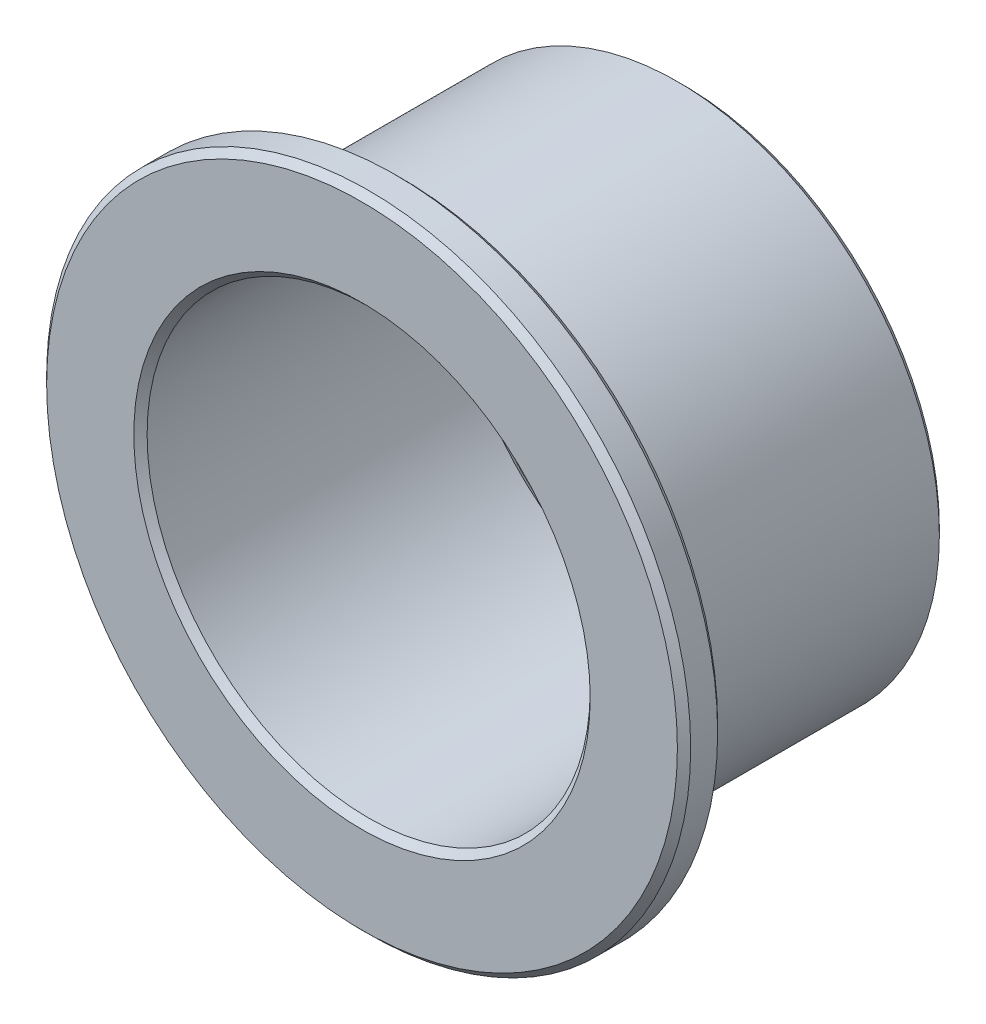
ISO-10303-21;
HEADER;
FILE_DESCRIPTION(('STEP AP214'),'2;1');
FILE_NAME('part.step','',(''),(''),'','','');
FILE_SCHEMA(('AUTOMOTIVE_DESIGN { 1 0 10303 214 1 1 1 1 }'));
ENDSEC;
DATA;
#1=APPLICATION_CONTEXT('core data for automotive mechanical design processes');
#2=APPLICATION_PROTOCOL_DEFINITION('international standard','automotive_design',2000,#1);
#3=PRODUCT_CONTEXT('',#1,'mechanical');
#4=PRODUCT('Part','Part','',(#3));
#5=PRODUCT_RELATED_PRODUCT_CATEGORY('part','',(#4));
#6=PRODUCT_DEFINITION_FORMATION('','',#4);
#7=PRODUCT_DEFINITION_CONTEXT('part definition',#1,'design');
#8=PRODUCT_DEFINITION('design','',#6,#7);
#9=PRODUCT_DEFINITION_SHAPE('','',#8);
#10=(LENGTH_UNIT() NAMED_UNIT(*) SI_UNIT(.MILLI.,.METRE.));
#11=(NAMED_UNIT(*) PLANE_ANGLE_UNIT() SI_UNIT($,.RADIAN.));
#12=(NAMED_UNIT(*) SI_UNIT($,.STERADIAN.) SOLID_ANGLE_UNIT());
#13=UNCERTAINTY_MEASURE_WITH_UNIT(LENGTH_MEASURE(1.E-05),#10,'distance_accuracy_value','');
#14=(GEOMETRIC_REPRESENTATION_CONTEXT(3) GLOBAL_UNCERTAINTY_ASSIGNED_CONTEXT((#13)) GLOBAL_UNIT_ASSIGNED_CONTEXT((#10,
#11,#12)) REPRESENTATION_CONTEXT('',''));
#15=CARTESIAN_POINT('',(0.,0.,0.));
#16=DIRECTION('',(0.,0.,1.));
#17=DIRECTION('',(1.,0.,0.));
#18=AXIS2_PLACEMENT_3D('',#15,#16,#17);
#19=CARTESIAN_POINT('',(0.,0.,9.525));
#20=DIRECTION('',(0.,0.,1.));
#21=DIRECTION('',(1.,0.,0.));
#22=AXIS2_PLACEMENT_3D('',#19,#20,#21);
#23=CYLINDRICAL_SURFACE('',#22,25.4);
#24=CARTESIAN_POINT('',(0.,0.,12.175744));
#25=DIRECTION('',(0.,0.,1.));
#26=DIRECTION('',(1.,0.,0.));
#27=AXIS2_PLACEMENT_3D('',#24,#25,#26);
#28=CIRCLE('',#27,25.4);
#29=CARTESIAN_POINT('',(25.4,0.,12.175744));
#30=VERTEX_POINT('',#29);
#31=EDGE_CURVE('E63',#30,#30,#28,.F.);
#32=ORIENTED_EDGE('',*,*,#31,.T.);
#33=EDGE_LOOP('',(#32));
#34=FACE_BOUND('',#33,.T.);
#35=CARTESIAN_POINT('',(0.,0.,10.049256));
#36=DIRECTION('',(0.,0.,1.));
#37=DIRECTION('',(1.,0.,0.));
#38=AXIS2_PLACEMENT_3D('',#35,#36,#37);
#39=CIRCLE('',#38,25.4);
#40=CARTESIAN_POINT('',(25.4,0.,10.049256));
#41=VERTEX_POINT('',#40);
#42=EDGE_CURVE('E66',#41,#41,#39,.T.);
#43=ORIENTED_EDGE('',*,*,#42,.T.);
#44=EDGE_LOOP('',(#43));
#45=FACE_BOUND('',#44,.T.);
#46=ADVANCED_FACE('F37',(#34,#45),#23,.T.);
#47=CARTESIAN_POINT('',(0.,0.,9.525));
#48=DIRECTION('',(0.,0.,1.));
#49=DIRECTION('',(1.,0.,0.));
#50=AXIS2_PLACEMENT_3D('',#47,#48,#49);
#51=PLANE('',#50);
#52=CARTESIAN_POINT('',(0.,0.,9.525));
#53=DIRECTION('',(0.,0.,1.));
#54=DIRECTION('',(1.,0.,0.));
#55=AXIS2_PLACEMENT_3D('',#52,#53,#54);
#56=CIRCLE('',#55,24.875744);
#57=CARTESIAN_POINT('',(24.875744,0.,9.525));
#58=VERTEX_POINT('',#57);
#59=EDGE_CURVE('E57',#58,#58,#56,.F.);
#60=ORIENTED_EDGE('',*,*,#59,.T.);
#61=EDGE_LOOP('',(#60));
#62=FACE_BOUND('',#61,.T.);
#63=CARTESIAN_POINT('',(0.,0.,9.525));
#64=DIRECTION('',(0.,0.,1.));
#65=DIRECTION('',(1.,0.,0.));
#66=AXIS2_PLACEMENT_3D('',#63,#64,#65);
#67=CIRCLE('',#66,21.187156);
#68=CARTESIAN_POINT('',(21.187156,0.,9.525));
#69=VERTEX_POINT('',#68);
#70=EDGE_CURVE('E60',#69,#69,#67,.T.);
#71=ORIENTED_EDGE('',*,*,#70,.T.);
#72=EDGE_LOOP('',(#71));
#73=FACE_BOUND('',#72,.T.);
#74=ADVANCED_FACE('F97',(#62,#73),#51,.F.);
#75=CARTESIAN_POINT('',(0.,0.,12.7));
#76=DIRECTION('',(0.,0.,1.));
#77=DIRECTION('',(1.,0.,0.));
#78=AXIS2_PLACEMENT_3D('',#75,#76,#77);
#79=PLANE('',#78);
#80=CARTESIAN_POINT('',(0.,0.,12.7));
#81=DIRECTION('',(0.,0.,1.));
#82=DIRECTION('',(1.,0.,0.));
#83=AXIS2_PLACEMENT_3D('',#80,#81,#82);
#84=CIRCLE('',#83,17.999456);
#85=CARTESIAN_POINT('',(17.999456,0.,12.7));
#86=VERTEX_POINT('',#85);
#87=EDGE_CURVE('E69',#86,#86,#84,.F.);
#88=ORIENTED_EDGE('',*,*,#87,.T.);
#89=EDGE_LOOP('',(#88));
#90=FACE_BOUND('',#89,.T.);
#91=CARTESIAN_POINT('',(0.,0.,12.7));
#92=DIRECTION('',(0.,0.,1.));
#93=DIRECTION('',(1.,0.,0.));
#94=AXIS2_PLACEMENT_3D('',#91,#92,#93);
#95=CIRCLE('',#94,24.875744);
#96=CARTESIAN_POINT('',(24.875744,0.,12.7));
#97=VERTEX_POINT('',#96);
#98=EDGE_CURVE('E72',#97,#97,#95,.T.);
#99=ORIENTED_EDGE('',*,*,#98,.T.);
#100=EDGE_LOOP('',(#99));
#101=FACE_BOUND('',#100,.T.);
#102=ADVANCED_FACE('F103',(#90,#101),#79,.T.);
#103=CARTESIAN_POINT('',(0.,0.,9.525));
#104=DIRECTION('',(0.,0.,1.));
#105=DIRECTION('',(1.,0.,0.));
#106=AXIS2_PLACEMENT_3D('',#103,#104,#105);
#107=CYLINDRICAL_SURFACE('',#106,17.4752);
#108=CARTESIAN_POINT('',(0.,0.,12.175744));
#109=DIRECTION('',(0.,0.,1.));
#110=DIRECTION('',(1.,0.,0.));
#111=AXIS2_PLACEMENT_3D('',#108,#109,#110);
#112=CIRCLE('',#111,17.4752);
#113=CARTESIAN_POINT('',(17.4752,0.,12.175744));
#114=VERTEX_POINT('',#113);
#115=EDGE_CURVE('E75',#114,#114,#112,.T.);
#116=ORIENTED_EDGE('',*,*,#115,.T.);
#117=EDGE_LOOP('',(#116));
#118=FACE_BOUND('',#117,.T.);
#119=CARTESIAN_POINT('',(0.,0.,-12.175744));
#120=DIRECTION('',(0.,0.,1.));
#121=DIRECTION('',(1.,0.,0.));
#122=AXIS2_PLACEMENT_3D('',#119,#120,#121);
#123=CIRCLE('',#122,17.4752);
#124=CARTESIAN_POINT('',(17.4752,0.,-12.175744));
#125=VERTEX_POINT('',#124);
#126=EDGE_CURVE('E78',#125,#125,#123,.F.);
#127=ORIENTED_EDGE('',*,*,#126,.T.);
#128=EDGE_LOOP('',(#127));
#129=FACE_BOUND('',#128,.T.);
#130=ADVANCED_FACE('F82',(#118,#129),#107,.F.);
#131=CARTESIAN_POINT('',(0.,0.,-12.7));
#132=DIRECTION('',(0.,0.,1.));
#133=DIRECTION('',(1.,0.,0.));
#134=AXIS2_PLACEMENT_3D('',#131,#132,#133);
#135=CYLINDRICAL_SURFACE('',#134,20.6629);
#136=CARTESIAN_POINT('',(0.,0.,9.000744));
#137=DIRECTION('',(0.,0.,1.));
#138=DIRECTION('',(1.,0.,0.));
#139=AXIS2_PLACEMENT_3D('',#136,#137,#138);
#140=CIRCLE('',#139,20.6629);
#141=CARTESIAN_POINT('',(20.6629,0.,9.000744));
#142=VERTEX_POINT('',#141);
#143=EDGE_CURVE('E48',#142,#142,#140,.F.);
#144=ORIENTED_EDGE('',*,*,#143,.T.);
#145=EDGE_LOOP('',(#144));
#146=FACE_BOUND('',#145,.T.);
#147=CARTESIAN_POINT('',(0.,0.,-12.175744));
#148=DIRECTION('',(0.,0.,1.));
#149=DIRECTION('',(1.,0.,0.));
#150=AXIS2_PLACEMENT_3D('',#147,#148,#149);
#151=CIRCLE('',#150,20.6629);
#152=CARTESIAN_POINT('',(20.6629,0.,-12.175744));
#153=VERTEX_POINT('',#152);
#154=EDGE_CURVE('E52',#153,#153,#151,.T.);
#155=ORIENTED_EDGE('',*,*,#154,.T.);
#156=EDGE_LOOP('',(#155));
#157=FACE_BOUND('',#156,.T.);
#158=ADVANCED_FACE('F152',(#146,#157),#135,.T.);
#159=CARTESIAN_POINT('',(0.,0.,-12.7));
#160=DIRECTION('',(0.,0.,1.));
#161=DIRECTION('',(1.,0.,0.));
#162=AXIS2_PLACEMENT_3D('',#159,#160,#161);
#163=PLANE('',#162);
#164=CARTESIAN_POINT('',(0.,0.,-12.7));
#165=DIRECTION('',(0.,0.,1.));
#166=DIRECTION('',(1.,0.,0.));
#167=AXIS2_PLACEMENT_3D('',#164,#165,#166);
#168=CIRCLE('',#167,17.999456);
#169=CARTESIAN_POINT('',(17.999456,0.,-12.7));
#170=VERTEX_POINT('',#169);
#171=EDGE_CURVE('E10',#170,#170,#168,.T.);
#172=ORIENTED_EDGE('',*,*,#171,.T.);
#173=EDGE_LOOP('',(#172));
#174=FACE_BOUND('',#173,.T.);
#175=CARTESIAN_POINT('',(0.,0.,-12.7));
#176=DIRECTION('',(0.,0.,1.));
#177=DIRECTION('',(1.,0.,0.));
#178=AXIS2_PLACEMENT_3D('',#175,#176,#177);
#179=CIRCLE('',#178,20.138644);
#180=CARTESIAN_POINT('',(20.138644,0.,-12.7));
#181=VERTEX_POINT('',#180);
#182=EDGE_CURVE('E44',#181,#181,#179,.F.);
#183=ORIENTED_EDGE('',*,*,#182,.T.);
#184=EDGE_LOOP('',(#183));
#185=FACE_BOUND('',#184,.T.);
#186=ADVANCED_FACE('F113',(#174,#185),#163,.F.);
#187=CARTESIAN_POINT('',(0.,0.,12.175744));
#188=DIRECTION('',(0.,0.,1.));
#189=DIRECTION('',(1.,0.,0.));
#190=AXIS2_PLACEMENT_3D('',#187,#188,#189);
#191=CONICAL_SURFACE('',#190,17.4752,0.785398163397442);
#192=ORIENTED_EDGE('',*,*,#87,.F.);
#193=EDGE_LOOP('',(#192));
#194=FACE_BOUND('',#193,.T.);
#195=ORIENTED_EDGE('',*,*,#115,.F.);
#196=EDGE_LOOP('',(#195));
#197=FACE_BOUND('',#196,.T.);
#198=ADVANCED_FACE('F109',(#194,#197),#191,.F.);
#199=CARTESIAN_POINT('',(0.,0.,12.7));
#200=DIRECTION('',(0.,0.,-1.));
#201=DIRECTION('',(-1.,0.,0.));
#202=AXIS2_PLACEMENT_3D('',#199,#200,#201);
#203=CONICAL_SURFACE('',#202,24.875744,0.785398163397452);
#204=ORIENTED_EDGE('',*,*,#31,.F.);
#205=EDGE_LOOP('',(#204));
#206=FACE_BOUND('',#205,.T.);
#207=ORIENTED_EDGE('',*,*,#98,.F.);
#208=EDGE_LOOP('',(#207));
#209=FACE_BOUND('',#208,.T.);
#210=ADVANCED_FACE('F112',(#206,#209),#203,.T.);
#211=CARTESIAN_POINT('',(0.,0.,10.049256));
#212=DIRECTION('',(0.,0.,1.));
#213=DIRECTION('',(1.,0.,0.));
#214=AXIS2_PLACEMENT_3D('',#211,#212,#213);
#215=CONICAL_SURFACE('',#214,25.4,0.785398163397445);
#216=ORIENTED_EDGE('',*,*,#59,.F.);
#217=EDGE_LOOP('',(#216));
#218=FACE_BOUND('',#217,.T.);
#219=ORIENTED_EDGE('',*,*,#42,.F.);
#220=EDGE_LOOP('',(#219));
#221=FACE_BOUND('',#220,.T.);
#222=ADVANCED_FACE('F93',(#218,#221),#215,.T.);
#223=CARTESIAN_POINT('',(0.,0.,9.525));
#224=DIRECTION('',(0.,0.,1.));
#225=DIRECTION('',(1.,0.,0.));
#226=AXIS2_PLACEMENT_3D('',#223,#224,#225);
#227=CONICAL_SURFACE('',#226,21.187156,0.785398163397458);
#228=ORIENTED_EDGE('',*,*,#143,.F.);
#229=EDGE_LOOP('',(#228));
#230=FACE_BOUND('',#229,.T.);
#231=ORIENTED_EDGE('',*,*,#70,.F.);
#232=EDGE_LOOP('',(#231));
#233=FACE_BOUND('',#232,.T.);
#234=ADVANCED_FACE('F87',(#230,#233),#227,.T.);
#235=CARTESIAN_POINT('',(0.,0.,-12.7));
#236=DIRECTION('',(0.,0.,-1.));
#237=DIRECTION('',(-1.,0.,0.));
#238=AXIS2_PLACEMENT_3D('',#235,#236,#237);
#239=CONICAL_SURFACE('',#238,17.999456,0.785398163397445);
#240=ORIENTED_EDGE('',*,*,#126,.F.);
#241=EDGE_LOOP('',(#240));
#242=FACE_BOUND('',#241,.T.);
#243=ORIENTED_EDGE('',*,*,#171,.F.);
#244=EDGE_LOOP('',(#243));
#245=FACE_BOUND('',#244,.T.);
#246=ADVANCED_FACE('F84',(#242,#245),#239,.F.);
#247=CARTESIAN_POINT('',(0.,0.,-12.175744));
#248=DIRECTION('',(0.,0.,1.));
#249=DIRECTION('',(1.,0.,0.));
#250=AXIS2_PLACEMENT_3D('',#247,#248,#249);
#251=CONICAL_SURFACE('',#250,20.6629,0.785398163397445);
#252=ORIENTED_EDGE('',*,*,#182,.F.);
#253=EDGE_LOOP('',(#252));
#254=FACE_BOUND('',#253,.T.);
#255=ORIENTED_EDGE('',*,*,#154,.F.);
#256=EDGE_LOOP('',(#255));
#257=FACE_BOUND('',#256,.T.);
#258=ADVANCED_FACE('F39',(#254,#257),#251,.T.);
#259=CLOSED_SHELL('',(#46,#74,#102,#130,#158,#186,#198,#210,#222,#234,#246,#258));
#260=MANIFOLD_SOLID_BREP('B2',#259);
#261=ADVANCED_BREP_SHAPE_REPRESENTATION('',(#18,#260),#14);
#262=SHAPE_DEFINITION_REPRESENTATION(#9,#261);
ENDSEC;
END-ISO-10303-21;
